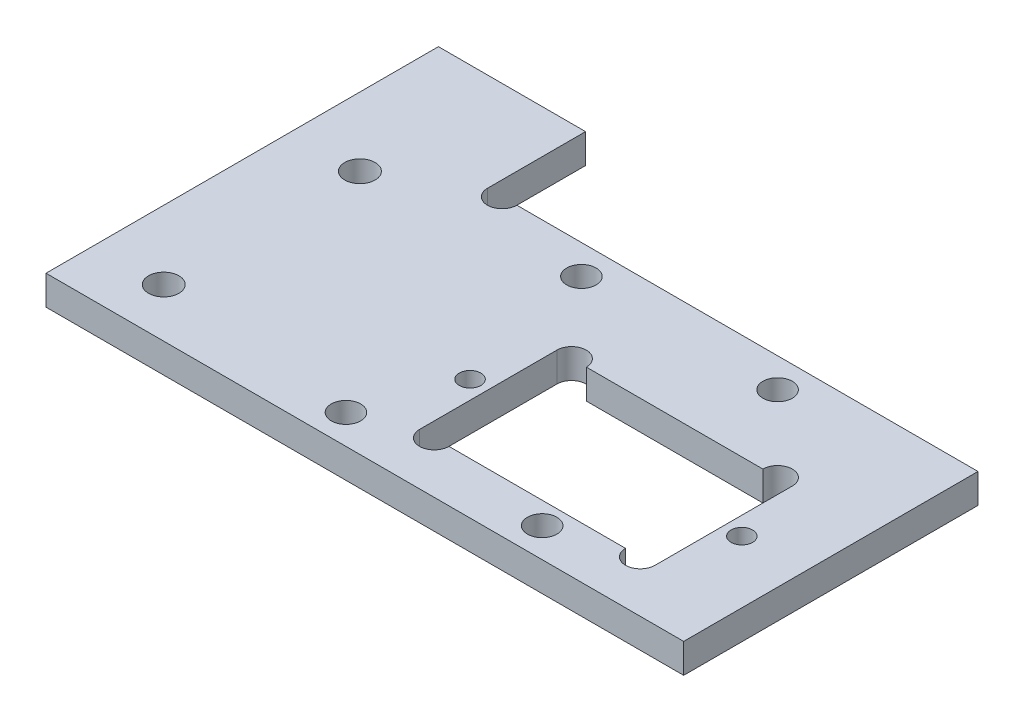
ISO-10303-21;
HEADER;
FILE_DESCRIPTION(('STEP AP214'),'2;1');
FILE_NAME('part.step','',(''),(''),'','','');
FILE_SCHEMA(('AUTOMOTIVE_DESIGN { 1 0 10303 214 1 1 1 1 }'));
ENDSEC;
DATA;
#1=APPLICATION_CONTEXT('core data for automotive mechanical design processes');
#2=APPLICATION_PROTOCOL_DEFINITION('international standard','automotive_design',2000,#1);
#3=PRODUCT_CONTEXT('',#1,'mechanical');
#4=PRODUCT('Part','Part','',(#3));
#5=PRODUCT_RELATED_PRODUCT_CATEGORY('part','',(#4));
#6=PRODUCT_DEFINITION_FORMATION('','',#4);
#7=PRODUCT_DEFINITION_CONTEXT('part definition',#1,'design');
#8=PRODUCT_DEFINITION('design','',#6,#7);
#9=PRODUCT_DEFINITION_SHAPE('','',#8);
#10=(LENGTH_UNIT() NAMED_UNIT(*) SI_UNIT(.MILLI.,.METRE.));
#11=(NAMED_UNIT(*) PLANE_ANGLE_UNIT() SI_UNIT($,.RADIAN.));
#12=(NAMED_UNIT(*) SI_UNIT($,.STERADIAN.) SOLID_ANGLE_UNIT());
#13=UNCERTAINTY_MEASURE_WITH_UNIT(LENGTH_MEASURE(1.E-05),#10,'distance_accuracy_value','');
#14=(GEOMETRIC_REPRESENTATION_CONTEXT(3) GLOBAL_UNCERTAINTY_ASSIGNED_CONTEXT((#13)) GLOBAL_UNIT_ASSIGNED_CONTEXT((#10,
#11,#12)) REPRESENTATION_CONTEXT('',''));
#15=CARTESIAN_POINT('',(0.,0.,0.));
#16=DIRECTION('',(0.,0.,1.));
#17=DIRECTION('',(1.,0.,0.));
#18=AXIS2_PLACEMENT_3D('',#15,#16,#17);
#19=CARTESIAN_POINT('',(32.5,3.,-20.));
#20=DIRECTION('',(-1.,0.,0.));
#21=DIRECTION('',(0.,0.,1.));
#22=AXIS2_PLACEMENT_3D('',#19,#20,#21);
#23=PLANE('',#22);
#24=DIRECTION('',(0.,0.,-1.));
#25=VECTOR('',#24,1.);
#26=CARTESIAN_POINT('',(32.5,0.,-20.));
#27=LINE('',#26,#25);
#28=CARTESIAN_POINT('',(32.5,0.,20.));
#29=VERTEX_POINT('',#28);
#30=CARTESIAN_POINT('',(32.5,0.,-9.99999999999998));
#31=VERTEX_POINT('',#30);
#32=EDGE_CURVE('E206',#29,#31,#27,.T.);
#33=ORIENTED_EDGE('',*,*,#32,.T.);
#34=DIRECTION('',(0.,-1.,0.));
#35=VECTOR('',#34,1.);
#36=CARTESIAN_POINT('',(32.5,10.,-9.99999999999998));
#37=LINE('',#36,#35);
#38=CARTESIAN_POINT('',(32.5,3.,-9.99999999999998));
#39=VERTEX_POINT('',#38);
#40=EDGE_CURVE('E166',#39,#31,#37,.T.);
#41=ORIENTED_EDGE('',*,*,#40,.F.);
#42=DIRECTION('',(0.,0.,-1.));
#43=VECTOR('',#42,1.);
#44=CARTESIAN_POINT('',(32.5,3.,-20.));
#45=LINE('',#44,#43);
#46=CARTESIAN_POINT('',(32.5,3.,20.));
#47=VERTEX_POINT('',#46);
#48=EDGE_CURVE('E207',#47,#39,#45,.T.);
#49=ORIENTED_EDGE('',*,*,#48,.F.);
#50=DIRECTION('',(0.,-1.,0.));
#51=VECTOR('',#50,1.);
#52=CARTESIAN_POINT('',(32.5,3.,20.));
#53=LINE('',#52,#51);
#54=EDGE_CURVE('E220',#47,#29,#53,.T.);
#55=ORIENTED_EDGE('',*,*,#54,.T.);
#56=EDGE_LOOP('',(#33,#41,#49,#55));
#57=FACE_BOUND('',#56,.T.);
#58=ADVANCED_FACE('F45',(#57),#23,.F.);
#59=CARTESIAN_POINT('',(-32.5,3.,-20.));
#60=DIRECTION('',(0.,0.,1.));
#61=DIRECTION('',(1.,0.,0.));
#62=AXIS2_PLACEMENT_3D('',#59,#60,#61);
#63=PLANE('',#62);
#64=DIRECTION('',(-1.,0.,0.));
#65=VECTOR('',#64,1.);
#66=CARTESIAN_POINT('',(-32.5,3.,-20.));
#67=LINE('',#66,#65);
#68=CARTESIAN_POINT('',(-17.5,3.,-20.));
#69=VERTEX_POINT('',#68);
#70=CARTESIAN_POINT('',(-32.5,3.,-20.));
#71=VERTEX_POINT('',#70);
#72=EDGE_CURVE('E211',#69,#71,#67,.T.);
#73=ORIENTED_EDGE('',*,*,#72,.F.);
#74=DIRECTION('',(0.,-1.,0.));
#75=VECTOR('',#74,1.);
#76=CARTESIAN_POINT('',(-17.5,10.,-20.));
#77=LINE('',#76,#75);
#78=CARTESIAN_POINT('',(-17.5,0.,-20.));
#79=VERTEX_POINT('',#78);
#80=EDGE_CURVE('E165',#69,#79,#77,.T.);
#81=ORIENTED_EDGE('',*,*,#80,.T.);
#82=DIRECTION('',(-1.,0.,0.));
#83=VECTOR('',#82,1.);
#84=CARTESIAN_POINT('',(-32.5,0.,-20.));
#85=LINE('',#84,#83);
#86=CARTESIAN_POINT('',(-32.5,0.,-20.));
#87=VERTEX_POINT('',#86);
#88=EDGE_CURVE('E171',#79,#87,#85,.T.);
#89=ORIENTED_EDGE('',*,*,#88,.T.);
#90=DIRECTION('',(0.,-1.,0.));
#91=VECTOR('',#90,1.);
#92=CARTESIAN_POINT('',(-32.5,3.,-20.));
#93=LINE('',#92,#91);
#94=EDGE_CURVE('E238',#71,#87,#93,.T.);
#95=ORIENTED_EDGE('',*,*,#94,.F.);
#96=EDGE_LOOP('',(#73,#81,#89,#95));
#97=FACE_BOUND('',#96,.T.);
#98=ADVANCED_FACE('F402',(#97),#63,.F.);
#99=CARTESIAN_POINT('',(-32.5,3.,-20.));
#100=DIRECTION('',(1.,0.,0.));
#101=DIRECTION('',(0.,0.,-1.));
#102=AXIS2_PLACEMENT_3D('',#99,#100,#101);
#103=PLANE('',#102);
#104=DIRECTION('',(0.,0.,1.));
#105=VECTOR('',#104,1.);
#106=CARTESIAN_POINT('',(-32.5,0.,-20.));
#107=LINE('',#106,#105);
#108=CARTESIAN_POINT('',(-32.5,0.,20.));
#109=VERTEX_POINT('',#108);
#110=EDGE_CURVE('E226',#87,#109,#107,.T.);
#111=ORIENTED_EDGE('',*,*,#110,.T.);
#112=DIRECTION('',(0.,-1.,0.));
#113=VECTOR('',#112,1.);
#114=CARTESIAN_POINT('',(-32.5,3.,20.));
#115=LINE('',#114,#113);
#116=CARTESIAN_POINT('',(-32.5,3.,20.));
#117=VERTEX_POINT('',#116);
#118=EDGE_CURVE('E234',#117,#109,#115,.T.);
#119=ORIENTED_EDGE('',*,*,#118,.F.);
#120=DIRECTION('',(0.,0.,1.));
#121=VECTOR('',#120,1.);
#122=CARTESIAN_POINT('',(-32.5,3.,-20.));
#123=LINE('',#122,#121);
#124=EDGE_CURVE('E215',#71,#117,#123,.T.);
#125=ORIENTED_EDGE('',*,*,#124,.F.);
#126=ORIENTED_EDGE('',*,*,#94,.T.);
#127=EDGE_LOOP('',(#111,#119,#125,#126));
#128=FACE_BOUND('',#127,.T.);
#129=ADVANCED_FACE('F406',(#128),#103,.F.);
#130=CARTESIAN_POINT('',(-32.5,3.,20.));
#131=DIRECTION('',(0.,0.,-1.));
#132=DIRECTION('',(-1.,0.,0.));
#133=AXIS2_PLACEMENT_3D('',#130,#131,#132);
#134=PLANE('',#133);
#135=DIRECTION('',(1.,0.,0.));
#136=VECTOR('',#135,1.);
#137=CARTESIAN_POINT('',(-32.5,0.,20.));
#138=LINE('',#137,#136);
#139=EDGE_CURVE('E212',#109,#29,#138,.T.);
#140=ORIENTED_EDGE('',*,*,#139,.T.);
#141=ORIENTED_EDGE('',*,*,#54,.F.);
#142=DIRECTION('',(1.,0.,0.));
#143=VECTOR('',#142,1.);
#144=CARTESIAN_POINT('',(-32.5,3.,20.));
#145=LINE('',#144,#143);
#146=EDGE_CURVE('E217',#117,#47,#145,.T.);
#147=ORIENTED_EDGE('',*,*,#146,.F.);
#148=ORIENTED_EDGE('',*,*,#118,.T.);
#149=EDGE_LOOP('',(#140,#141,#147,#148));
#150=FACE_BOUND('',#149,.T.);
#151=ADVANCED_FACE('F378',(#150),#134,.F.);
#152=CARTESIAN_POINT('',(0.,3.,0.));
#153=DIRECTION('',(0.,1.,0.));
#154=DIRECTION('',(0.,0.,1.));
#155=AXIS2_PLACEMENT_3D('',#152,#153,#154);
#156=PLANE('',#155);
#157=CARTESIAN_POINT('',(-16.,3.,-9.99999999999998));
#158=DIRECTION('',(0.,1.,0.));
#159=DIRECTION('',(0.,0.,1.));
#160=AXIS2_PLACEMENT_3D('',#157,#158,#159);
#161=CIRCLE('',#160,1.50000000000001);
#162=CARTESIAN_POINT('',(-17.5,3.,-9.99999999999998));
#163=VERTEX_POINT('',#162);
#164=CARTESIAN_POINT('',(-14.5,3.,-9.99999999999998));
#165=VERTEX_POINT('',#164);
#166=EDGE_CURVE('E416',#163,#165,#161,.T.);
#167=ORIENTED_EDGE('',*,*,#166,.F.);
#168=DIRECTION('',(0.,0.,1.));
#169=VECTOR('',#168,1.);
#170=CARTESIAN_POINT('',(-17.5,3.,0.));
#171=LINE('',#170,#169);
#172=EDGE_CURVE('E163',#69,#163,#171,.T.);
#173=ORIENTED_EDGE('',*,*,#172,.F.);
#174=ORIENTED_EDGE('',*,*,#72,.T.);
#175=ORIENTED_EDGE('',*,*,#124,.T.);
#176=ORIENTED_EDGE('',*,*,#146,.T.);
#177=ORIENTED_EDGE('',*,*,#48,.T.);
#178=DIRECTION('',(1.,0.,0.));
#179=VECTOR('',#178,1.);
#180=CARTESIAN_POINT('',(0.,3.,-9.99999999999998));
#181=LINE('',#180,#179);
#182=EDGE_CURVE('E185',#165,#39,#181,.T.);
#183=ORIENTED_EDGE('',*,*,#182,.F.);
#184=EDGE_LOOP('',(#167,#173,#174,#175,#176,#177,#183));
#185=FACE_BOUND('',#184,.T.);
#186=CARTESIAN_POINT('',(1.82494999997478,3.,0.750000000000394));
#187=DIRECTION('',(0.,1.,0.));
#188=DIRECTION('',(0.,0.,1.));
#189=AXIS2_PLACEMENT_3D('',#186,#187,#188);
#190=CIRCLE('',#189,1.50000000000001);
#191=CARTESIAN_POINT('',(3.32494999997479,3.,0.750000000000394));
#192=VERTEX_POINT('',#191);
#193=CARTESIAN_POINT('',(0.324949999974764,3.,0.750000000000394));
#194=VERTEX_POINT('',#193);
#195=EDGE_CURVE('E319',#192,#194,#190,.T.);
#196=ORIENTED_EDGE('',*,*,#195,.F.);
#197=DIRECTION('',(-1.,0.,0.));
#198=VECTOR('',#197,1.);
#199=CARTESIAN_POINT('',(0.,3.,0.750000000000394));
#200=LINE('',#199,#198);
#201=CARTESIAN_POINT('',(21.3249499999748,3.,0.750000000000394));
#202=VERTEX_POINT('',#201);
#203=EDGE_CURVE('E292',#202,#192,#200,.T.);
#204=ORIENTED_EDGE('',*,*,#203,.F.);
#205=CARTESIAN_POINT('',(22.8249499999748,3.,0.750000000000394));
#206=DIRECTION('',(0.,1.,0.));
#207=DIRECTION('',(0.,0.,1.));
#208=AXIS2_PLACEMENT_3D('',#205,#206,#207);
#209=CIRCLE('',#208,1.50000000000002);
#210=CARTESIAN_POINT('',(24.3249499999748,3.,0.750000000000394));
#211=VERTEX_POINT('',#210);
#212=EDGE_CURVE('E599',#211,#202,#209,.T.);
#213=ORIENTED_EDGE('',*,*,#212,.F.);
#214=DIRECTION('',(0.,0.,-1.));
#215=VECTOR('',#214,1.);
#216=CARTESIAN_POINT('',(24.3249499999748,3.,0.));
#217=LINE('',#216,#215);
#218=CARTESIAN_POINT('',(24.3249499999748,3.,14.7500000000004));
#219=VERTEX_POINT('',#218);
#220=EDGE_CURVE('E305',#219,#211,#217,.T.);
#221=ORIENTED_EDGE('',*,*,#220,.F.);
#222=CARTESIAN_POINT('',(22.8249499999748,3.,14.7500000000004));
#223=DIRECTION('',(0.,1.,0.));
#224=DIRECTION('',(0.,0.,1.));
#225=AXIS2_PLACEMENT_3D('',#222,#223,#224);
#226=CIRCLE('',#225,1.50000000000002);
#227=CARTESIAN_POINT('',(21.3249499999748,3.,14.7500000000004));
#228=VERTEX_POINT('',#227);
#229=EDGE_CURVE('E332',#228,#219,#226,.T.);
#230=ORIENTED_EDGE('',*,*,#229,.F.);
#231=DIRECTION('',(1.,0.,0.));
#232=VECTOR('',#231,1.);
#233=CARTESIAN_POINT('',(0.,3.,14.7500000000004));
#234=LINE('',#233,#232);
#235=CARTESIAN_POINT('',(3.32494999997479,3.,14.7500000000004));
#236=VERTEX_POINT('',#235);
#237=EDGE_CURVE('E309',#236,#228,#234,.T.);
#238=ORIENTED_EDGE('',*,*,#237,.F.);
#239=CARTESIAN_POINT('',(1.82494999997478,3.,14.7500000000004));
#240=DIRECTION('',(0.,1.,0.));
#241=DIRECTION('',(0.,0.,1.));
#242=AXIS2_PLACEMENT_3D('',#239,#240,#241);
#243=CIRCLE('',#242,1.50000000000001);
#244=CARTESIAN_POINT('',(0.324949999974764,3.,14.7500000000004));
#245=VERTEX_POINT('',#244);
#246=EDGE_CURVE('E321',#245,#236,#243,.T.);
#247=ORIENTED_EDGE('',*,*,#246,.F.);
#248=DIRECTION('',(0.,0.,1.));
#249=VECTOR('',#248,1.);
#250=CARTESIAN_POINT('',(0.324949999974778,3.,0.));
#251=LINE('',#250,#249);
#252=EDGE_CURVE('E180',#194,#245,#251,.T.);
#253=ORIENTED_EDGE('',*,*,#252,.F.);
#254=EDGE_LOOP('',(#196,#204,#213,#221,#230,#238,#247,#253));
#255=FACE_BOUND('',#254,.T.);
#256=CARTESIAN_POINT('',(-4.92502499999987,3.,16.9999999999999));
#257=DIRECTION('',(0.,1.,0.));
#258=DIRECTION('',(0.,0.,1.));
#259=AXIS2_PLACEMENT_3D('',#256,#257,#258);
#260=CIRCLE('',#259,1.5);
#261=CARTESIAN_POINT('',(-4.92502499999987,3.,18.4999999999999));
#262=VERTEX_POINT('',#261);
#263=EDGE_CURVE('E362',#262,#262,#260,.T.);
#264=ORIENTED_EDGE('',*,*,#263,.F.);
#265=EDGE_LOOP('',(#264));
#266=FACE_BOUND('',#265,.T.);
#267=CARTESIAN_POINT('',(15.0749750000001,3.,-7.00000000000009));
#268=DIRECTION('',(0.,1.,0.));
#269=DIRECTION('',(0.,0.,1.));
#270=AXIS2_PLACEMENT_3D('',#267,#268,#269);
#271=CIRCLE('',#270,1.5);
#272=CARTESIAN_POINT('',(15.0749750000001,3.,-5.50000000000009));
#273=VERTEX_POINT('',#272);
#274=EDGE_CURVE('E358',#273,#273,#271,.T.);
#275=ORIENTED_EDGE('',*,*,#274,.F.);
#276=EDGE_LOOP('',(#275));
#277=FACE_BOUND('',#276,.T.);
#278=CARTESIAN_POINT('',(-4.9250249999999,3.,-7.00000000000008));
#279=DIRECTION('',(0.,1.,0.));
#280=DIRECTION('',(0.,0.,1.));
#281=AXIS2_PLACEMENT_3D('',#278,#279,#280);
#282=CIRCLE('',#281,1.5);
#283=CARTESIAN_POINT('',(-4.9250249999999,3.,-5.50000000000008));
#284=VERTEX_POINT('',#283);
#285=EDGE_CURVE('E354',#284,#284,#282,.T.);
#286=ORIENTED_EDGE('',*,*,#285,.F.);
#287=EDGE_LOOP('',(#286));
#288=FACE_BOUND('',#287,.T.);
#289=CARTESIAN_POINT('',(15.0749750000001,3.,16.9999999999999));
#290=DIRECTION('',(0.,1.,0.));
#291=DIRECTION('',(0.,0.,1.));
#292=AXIS2_PLACEMENT_3D('',#289,#290,#291);
#293=CIRCLE('',#292,1.5);
#294=CARTESIAN_POINT('',(15.0749750000001,3.,18.4999999999999));
#295=VERTEX_POINT('',#294);
#296=EDGE_CURVE('E351',#295,#295,#293,.T.);
#297=ORIENTED_EDGE('',*,*,#296,.F.);
#298=EDGE_LOOP('',(#297));
#299=FACE_BOUND('',#298,.T.);
#300=CARTESIAN_POINT('',(26.1749499999748,3.,7.7500000000004));
#301=DIRECTION('',(0.,1.,0.));
#302=DIRECTION('',(0.,0.,1.));
#303=AXIS2_PLACEMENT_3D('',#300,#301,#302);
#304=CIRCLE('',#303,1.10000000000004);
#305=CARTESIAN_POINT('',(26.1749499999748,3.,8.85000000000043));
#306=VERTEX_POINT('',#305);
#307=EDGE_CURVE('E248',#306,#306,#304,.T.);
#308=ORIENTED_EDGE('',*,*,#307,.F.);
#309=EDGE_LOOP('',(#308));
#310=FACE_BOUND('',#309,.T.);
#311=CARTESIAN_POINT('',(-1.52505000002522,3.,7.75000000000042));
#312=DIRECTION('',(0.,1.,0.));
#313=DIRECTION('',(0.,0.,1.));
#314=AXIS2_PLACEMENT_3D('',#311,#312,#313);
#315=CIRCLE('',#314,1.1);
#316=CARTESIAN_POINT('',(-1.52505000002522,3.,8.85000000000042));
#317=VERTEX_POINT('',#316);
#318=EDGE_CURVE('E281',#317,#317,#315,.T.);
#319=ORIENTED_EDGE('',*,*,#318,.F.);
#320=EDGE_LOOP('',(#319));
#321=FACE_BOUND('',#320,.T.);
#322=CARTESIAN_POINT('',(-25.5,3.,15.));
#323=DIRECTION('',(0.,1.,0.));
#324=DIRECTION('',(0.,0.,1.));
#325=AXIS2_PLACEMENT_3D('',#322,#323,#324);
#326=CIRCLE('',#325,1.55);
#327=CARTESIAN_POINT('',(-25.5,3.,16.55));
#328=VERTEX_POINT('',#327);
#329=EDGE_CURVE('E202',#328,#328,#326,.T.);
#330=ORIENTED_EDGE('',*,*,#329,.F.);
#331=EDGE_LOOP('',(#330));
#332=FACE_BOUND('',#331,.T.);
#333=CARTESIAN_POINT('',(-25.5,3.,-5.00000000000002));
#334=DIRECTION('',(0.,1.,0.));
#335=DIRECTION('',(0.,0.,1.));
#336=AXIS2_PLACEMENT_3D('',#333,#334,#335);
#337=CIRCLE('',#336,1.55);
#338=CARTESIAN_POINT('',(-25.5,3.,-3.45000000000002));
#339=VERTEX_POINT('',#338);
#340=EDGE_CURVE('E196',#339,#339,#337,.T.);
#341=ORIENTED_EDGE('',*,*,#340,.F.);
#342=EDGE_LOOP('',(#341));
#343=FACE_BOUND('',#342,.T.);
#344=ADVANCED_FACE('F316',(#185,#255,#266,#277,#288,#299,#310,#321,#332,#343),#156,.T.);
#345=CARTESIAN_POINT('',(0.,0.,0.));
#346=DIRECTION('',(0.,1.,0.));
#347=DIRECTION('',(0.,0.,1.));
#348=AXIS2_PLACEMENT_3D('',#345,#346,#347);
#349=PLANE('',#348);
#350=CARTESIAN_POINT('',(-4.92502499999987,0.,16.9999999999999));
#351=DIRECTION('',(0.,-1.,0.));
#352=DIRECTION('',(0.,0.,-1.));
#353=AXIS2_PLACEMENT_3D('',#350,#351,#352);
#354=CIRCLE('',#353,1.5);
#355=CARTESIAN_POINT('',(-4.92502499999987,0.,15.4999999999999));
#356=VERTEX_POINT('',#355);
#357=EDGE_CURVE('E340',#356,#356,#354,.T.);
#358=ORIENTED_EDGE('',*,*,#357,.F.);
#359=EDGE_LOOP('',(#358));
#360=FACE_BOUND('',#359,.T.);
#361=CARTESIAN_POINT('',(15.0749750000001,0.,-7.00000000000009));
#362=DIRECTION('',(0.,-1.,0.));
#363=DIRECTION('',(0.,0.,-1.));
#364=AXIS2_PLACEMENT_3D('',#361,#362,#363);
#365=CIRCLE('',#364,1.5);
#366=CARTESIAN_POINT('',(15.0749750000001,0.,-8.5000000000001));
#367=VERTEX_POINT('',#366);
#368=EDGE_CURVE('E339',#367,#367,#365,.T.);
#369=ORIENTED_EDGE('',*,*,#368,.F.);
#370=EDGE_LOOP('',(#369));
#371=FACE_BOUND('',#370,.T.);
#372=CARTESIAN_POINT('',(-4.9250249999999,0.,-7.00000000000008));
#373=DIRECTION('',(0.,-1.,0.));
#374=DIRECTION('',(0.,0.,-1.));
#375=AXIS2_PLACEMENT_3D('',#372,#373,#374);
#376=CIRCLE('',#375,1.5);
#377=CARTESIAN_POINT('',(-4.9250249999999,0.,-8.50000000000008));
#378=VERTEX_POINT('',#377);
#379=EDGE_CURVE('E329',#378,#378,#376,.T.);
#380=ORIENTED_EDGE('',*,*,#379,.F.);
#381=EDGE_LOOP('',(#380));
#382=FACE_BOUND('',#381,.T.);
#383=CARTESIAN_POINT('',(15.0749750000001,0.,16.9999999999999));
#384=DIRECTION('',(0.,-1.,0.));
#385=DIRECTION('',(0.,0.,-1.));
#386=AXIS2_PLACEMENT_3D('',#383,#384,#385);
#387=CIRCLE('',#386,1.5);
#388=CARTESIAN_POINT('',(15.0749750000001,0.,15.4999999999999));
#389=VERTEX_POINT('',#388);
#390=EDGE_CURVE('E344',#389,#389,#387,.T.);
#391=ORIENTED_EDGE('',*,*,#390,.F.);
#392=EDGE_LOOP('',(#391));
#393=FACE_BOUND('',#392,.T.);
#394=CARTESIAN_POINT('',(26.1749499999748,0.,7.7500000000004));
#395=DIRECTION('',(0.,1.,0.));
#396=DIRECTION('',(0.,0.,1.));
#397=AXIS2_PLACEMENT_3D('',#394,#395,#396);
#398=CIRCLE('',#397,1.10000000000004);
#399=CARTESIAN_POINT('',(26.1749499999748,0.,8.85000000000043));
#400=VERTEX_POINT('',#399);
#401=EDGE_CURVE('E247',#400,#400,#398,.T.);
#402=ORIENTED_EDGE('',*,*,#401,.T.);
#403=EDGE_LOOP('',(#402));
#404=FACE_BOUND('',#403,.T.);
#405=CARTESIAN_POINT('',(-1.52505000002522,0.,7.75000000000042));
#406=DIRECTION('',(0.,1.,0.));
#407=DIRECTION('',(0.,0.,1.));
#408=AXIS2_PLACEMENT_3D('',#405,#406,#407);
#409=CIRCLE('',#408,1.1);
#410=CARTESIAN_POINT('',(-1.52505000002522,0.,8.85000000000042));
#411=VERTEX_POINT('',#410);
#412=EDGE_CURVE('E243',#411,#411,#409,.T.);
#413=ORIENTED_EDGE('',*,*,#412,.T.);
#414=EDGE_LOOP('',(#413));
#415=FACE_BOUND('',#414,.T.);
#416=DIRECTION('',(1.,0.,0.));
#417=VECTOR('',#416,1.);
#418=CARTESIAN_POINT('',(24.3249499999748,0.,0.750000000000394));
#419=LINE('',#418,#417);
#420=CARTESIAN_POINT('',(3.32494999997479,0.,0.750000000000394));
#421=VERTEX_POINT('',#420);
#422=CARTESIAN_POINT('',(21.3249499999748,0.,0.750000000000394));
#423=VERTEX_POINT('',#422);
#424=EDGE_CURVE('E66',#421,#423,#419,.T.);
#425=ORIENTED_EDGE('',*,*,#424,.F.);
#426=CARTESIAN_POINT('',(1.82494999997478,0.,0.750000000000394));
#427=DIRECTION('',(0.,1.,0.));
#428=DIRECTION('',(0.,0.,1.));
#429=AXIS2_PLACEMENT_3D('',#426,#427,#428);
#430=CIRCLE('',#429,1.50000000000001);
#431=CARTESIAN_POINT('',(0.324949999974778,0.,0.750000000000394));
#432=VERTEX_POINT('',#431);
#433=EDGE_CURVE('E52',#421,#432,#430,.T.);
#434=ORIENTED_EDGE('',*,*,#433,.T.);
#435=DIRECTION('',(0.,0.,-1.));
#436=VECTOR('',#435,1.);
#437=CARTESIAN_POINT('',(0.324949999974778,0.,0.750000000000394));
#438=LINE('',#437,#436);
#439=CARTESIAN_POINT('',(0.324949999974765,0.,14.7500000000004));
#440=VERTEX_POINT('',#439);
#441=EDGE_CURVE('E252',#440,#432,#438,.T.);
#442=ORIENTED_EDGE('',*,*,#441,.F.);
#443=CARTESIAN_POINT('',(1.82494999997478,0.,14.7500000000004));
#444=DIRECTION('',(0.,1.,0.));
#445=DIRECTION('',(0.,0.,1.));
#446=AXIS2_PLACEMENT_3D('',#443,#444,#445);
#447=CIRCLE('',#446,1.50000000000001);
#448=CARTESIAN_POINT('',(3.32494999997479,0.,14.7500000000004));
#449=VERTEX_POINT('',#448);
#450=EDGE_CURVE('E242',#440,#449,#447,.T.);
#451=ORIENTED_EDGE('',*,*,#450,.T.);
#452=DIRECTION('',(-1.,0.,0.));
#453=VECTOR('',#452,1.);
#454=CARTESIAN_POINT('',(24.3249499999748,0.,14.7500000000004));
#455=LINE('',#454,#453);
#456=CARTESIAN_POINT('',(21.3249499999748,0.,14.7500000000004));
#457=VERTEX_POINT('',#456);
#458=EDGE_CURVE('E287',#457,#449,#455,.T.);
#459=ORIENTED_EDGE('',*,*,#458,.F.);
#460=CARTESIAN_POINT('',(22.8249499999748,0.,14.7500000000004));
#461=DIRECTION('',(0.,1.,0.));
#462=DIRECTION('',(0.,0.,1.));
#463=AXIS2_PLACEMENT_3D('',#460,#461,#462);
#464=CIRCLE('',#463,1.50000000000001);
#465=CARTESIAN_POINT('',(24.3249499999748,0.,14.7500000000004));
#466=VERTEX_POINT('',#465);
#467=EDGE_CURVE('E255',#457,#466,#464,.T.);
#468=ORIENTED_EDGE('',*,*,#467,.T.);
#469=DIRECTION('',(0.,0.,1.));
#470=VECTOR('',#469,1.);
#471=CARTESIAN_POINT('',(24.3249499999748,0.,0.750000000000394));
#472=LINE('',#471,#470);
#473=CARTESIAN_POINT('',(24.3249499999748,0.,0.750000000000394));
#474=VERTEX_POINT('',#473);
#475=EDGE_CURVE('E278',#474,#466,#472,.T.);
#476=ORIENTED_EDGE('',*,*,#475,.F.);
#477=CARTESIAN_POINT('',(22.8249499999748,0.,0.750000000000394));
#478=DIRECTION('',(0.,1.,0.));
#479=DIRECTION('',(0.,0.,1.));
#480=AXIS2_PLACEMENT_3D('',#477,#478,#479);
#481=CIRCLE('',#480,1.50000000000001);
#482=EDGE_CURVE('E258',#474,#423,#481,.T.);
#483=ORIENTED_EDGE('',*,*,#482,.T.);
#484=EDGE_LOOP('',(#425,#434,#442,#451,#459,#468,#476,#483));
#485=FACE_BOUND('',#484,.T.);
#486=CARTESIAN_POINT('',(-25.5,0.,15.));
#487=DIRECTION('',(0.,-1.,0.));
#488=DIRECTION('',(0.,0.,-1.));
#489=AXIS2_PLACEMENT_3D('',#486,#487,#488);
#490=CIRCLE('',#489,1.55);
#491=CARTESIAN_POINT('',(-25.5,0.,13.45));
#492=VERTEX_POINT('',#491);
#493=EDGE_CURVE('E192',#492,#492,#490,.T.);
#494=ORIENTED_EDGE('',*,*,#493,.F.);
#495=EDGE_LOOP('',(#494));
#496=FACE_BOUND('',#495,.T.);
#497=CARTESIAN_POINT('',(-25.5,0.,-5.00000000000002));
#498=DIRECTION('',(0.,-1.,0.));
#499=DIRECTION('',(0.,0.,-1.));
#500=AXIS2_PLACEMENT_3D('',#497,#498,#499);
#501=CIRCLE('',#500,1.55);
#502=CARTESIAN_POINT('',(-25.5,0.,-6.55000000000002));
#503=VERTEX_POINT('',#502);
#504=EDGE_CURVE('E191',#503,#503,#501,.T.);
#505=ORIENTED_EDGE('',*,*,#504,.F.);
#506=EDGE_LOOP('',(#505));
#507=FACE_BOUND('',#506,.T.);
#508=DIRECTION('',(0.,0.,-1.));
#509=VECTOR('',#508,1.);
#510=CARTESIAN_POINT('',(-17.5,0.,-20.));
#511=LINE('',#510,#509);
#512=CARTESIAN_POINT('',(-17.5,0.,-9.99999999999998));
#513=VERTEX_POINT('',#512);
#514=EDGE_CURVE('E160',#513,#79,#511,.T.);
#515=ORIENTED_EDGE('',*,*,#514,.F.);
#516=CARTESIAN_POINT('',(-16.,0.,-9.99999999999998));
#517=DIRECTION('',(0.,1.,0.));
#518=DIRECTION('',(0.,0.,1.));
#519=AXIS2_PLACEMENT_3D('',#516,#517,#518);
#520=CIRCLE('',#519,1.50000000000001);
#521=CARTESIAN_POINT('',(-14.5,0.,-9.99999999999998));
#522=VERTEX_POINT('',#521);
#523=EDGE_CURVE('E11',#513,#522,#520,.T.);
#524=ORIENTED_EDGE('',*,*,#523,.T.);
#525=DIRECTION('',(-1.,0.,0.));
#526=VECTOR('',#525,1.);
#527=CARTESIAN_POINT('',(32.5,0.,-9.99999999999998));
#528=LINE('',#527,#526);
#529=EDGE_CURVE('E173',#31,#522,#528,.T.);
#530=ORIENTED_EDGE('',*,*,#529,.F.);
#531=ORIENTED_EDGE('',*,*,#32,.F.);
#532=ORIENTED_EDGE('',*,*,#139,.F.);
#533=ORIENTED_EDGE('',*,*,#110,.F.);
#534=ORIENTED_EDGE('',*,*,#88,.F.);
#535=EDGE_LOOP('',(#515,#524,#530,#531,#532,#533,#534));
#536=FACE_BOUND('',#535,.T.);
#537=ADVANCED_FACE('F169',(#360,#371,#382,#393,#404,#415,#485,#496,#507,#536),#349,.F.);
#538=CARTESIAN_POINT('',(-25.5,10.,-5.00000000000002));
#539=DIRECTION('',(0.,-1.,0.));
#540=DIRECTION('',(0.,0.,-1.));
#541=AXIS2_PLACEMENT_3D('',#538,#539,#540);
#542=CYLINDRICAL_SURFACE('',#541,1.55);
#543=ORIENTED_EDGE('',*,*,#340,.T.);
#544=EDGE_LOOP('',(#543));
#545=FACE_BOUND('',#544,.T.);
#546=ORIENTED_EDGE('',*,*,#504,.T.);
#547=EDGE_LOOP('',(#546));
#548=FACE_BOUND('',#547,.T.);
#549=ADVANCED_FACE('F385',(#545,#548),#542,.F.);
#550=CARTESIAN_POINT('',(-25.5,10.,15.));
#551=DIRECTION('',(0.,-1.,0.));
#552=DIRECTION('',(0.,0.,-1.));
#553=AXIS2_PLACEMENT_3D('',#550,#551,#552);
#554=CYLINDRICAL_SURFACE('',#553,1.55);
#555=ORIENTED_EDGE('',*,*,#329,.T.);
#556=EDGE_LOOP('',(#555));
#557=FACE_BOUND('',#556,.T.);
#558=ORIENTED_EDGE('',*,*,#493,.T.);
#559=EDGE_LOOP('',(#558));
#560=FACE_BOUND('',#559,.T.);
#561=ADVANCED_FACE('F388',(#557,#560),#554,.F.);
#562=CARTESIAN_POINT('',(-17.5,10.,-20.));
#563=DIRECTION('',(-1.,0.,0.));
#564=DIRECTION('',(0.,0.,1.));
#565=AXIS2_PLACEMENT_3D('',#562,#563,#564);
#566=PLANE('',#565);
#567=ORIENTED_EDGE('',*,*,#172,.T.);
#568=DIRECTION('',(0.,-1.,0.));
#569=VECTOR('',#568,1.);
#570=CARTESIAN_POINT('',(-17.5,10.,-9.99999999999998));
#571=LINE('',#570,#569);
#572=EDGE_CURVE('E151',#163,#513,#571,.T.);
#573=ORIENTED_EDGE('',*,*,#572,.T.);
#574=ORIENTED_EDGE('',*,*,#514,.T.);
#575=ORIENTED_EDGE('',*,*,#80,.F.);
#576=EDGE_LOOP('',(#567,#573,#574,#575));
#577=FACE_BOUND('',#576,.T.);
#578=ADVANCED_FACE('F159',(#577),#566,.F.);
#579=CARTESIAN_POINT('',(32.5,10.,-9.99999999999998));
#580=DIRECTION('',(0.,0.,1.));
#581=DIRECTION('',(1.,0.,0.));
#582=AXIS2_PLACEMENT_3D('',#579,#580,#581);
#583=PLANE('',#582);
#584=ORIENTED_EDGE('',*,*,#529,.T.);
#585=DIRECTION('',(0.,1.,0.));
#586=VECTOR('',#585,1.);
#587=CARTESIAN_POINT('',(-14.5,3.,-9.99999999999998));
#588=LINE('',#587,#586);
#589=EDGE_CURVE('E59',#522,#165,#588,.T.);
#590=ORIENTED_EDGE('',*,*,#589,.T.);
#591=ORIENTED_EDGE('',*,*,#182,.T.);
#592=ORIENTED_EDGE('',*,*,#40,.T.);
#593=EDGE_LOOP('',(#584,#590,#591,#592));
#594=FACE_BOUND('',#593,.T.);
#595=ADVANCED_FACE('F414',(#594),#583,.F.);
#596=CARTESIAN_POINT('',(0.324949999974778,10.,0.750000000000394));
#597=DIRECTION('',(-1.,0.,0.));
#598=DIRECTION('',(0.,0.,1.));
#599=AXIS2_PLACEMENT_3D('',#596,#597,#598);
#600=PLANE('',#599);
#601=ORIENTED_EDGE('',*,*,#252,.T.);
#602=DIRECTION('',(0.,-1.,0.));
#603=VECTOR('',#602,1.);
#604=CARTESIAN_POINT('',(0.324949999974778,10.,14.7500000000004));
#605=LINE('',#604,#603);
#606=EDGE_CURVE('E273',#245,#440,#605,.T.);
#607=ORIENTED_EDGE('',*,*,#606,.T.);
#608=ORIENTED_EDGE('',*,*,#441,.T.);
#609=DIRECTION('',(0.,-1.,0.));
#610=VECTOR('',#609,1.);
#611=CARTESIAN_POINT('',(0.324949999974778,10.,0.750000000000394));
#612=LINE('',#611,#610);
#613=EDGE_CURVE('E271',#194,#432,#612,.T.);
#614=ORIENTED_EDGE('',*,*,#613,.F.);
#615=EDGE_LOOP('',(#601,#607,#608,#614));
#616=FACE_BOUND('',#615,.T.);
#617=ADVANCED_FACE('F270',(#616),#600,.F.);
#618=CARTESIAN_POINT('',(24.3249499999748,10.,14.7500000000004));
#619=DIRECTION('',(0.,0.,1.));
#620=DIRECTION('',(1.,0.,0.));
#621=AXIS2_PLACEMENT_3D('',#618,#619,#620);
#622=PLANE('',#621);
#623=ORIENTED_EDGE('',*,*,#237,.T.);
#624=DIRECTION('',(0.,1.,0.));
#625=VECTOR('',#624,1.);
#626=CARTESIAN_POINT('',(21.3249499999748,3.,14.7500000000004));
#627=LINE('',#626,#625);
#628=EDGE_CURVE('E327',#228,#457,#627,.F.);
#629=ORIENTED_EDGE('',*,*,#628,.T.);
#630=ORIENTED_EDGE('',*,*,#458,.T.);
#631=DIRECTION('',(0.,1.,0.));
#632=VECTOR('',#631,1.);
#633=CARTESIAN_POINT('',(3.32494999997479,3.,14.7500000000004));
#634=LINE('',#633,#632);
#635=EDGE_CURVE('E326',#449,#236,#634,.T.);
#636=ORIENTED_EDGE('',*,*,#635,.T.);
#637=EDGE_LOOP('',(#623,#629,#630,#636));
#638=FACE_BOUND('',#637,.T.);
#639=ADVANCED_FACE('F468',(#638),#622,.F.);
#640=CARTESIAN_POINT('',(24.3249499999748,10.,0.750000000000394));
#641=DIRECTION('',(1.,0.,0.));
#642=DIRECTION('',(0.,0.,-1.));
#643=AXIS2_PLACEMENT_3D('',#640,#641,#642);
#644=PLANE('',#643);
#645=ORIENTED_EDGE('',*,*,#220,.T.);
#646=DIRECTION('',(0.,-1.,0.));
#647=VECTOR('',#646,1.);
#648=CARTESIAN_POINT('',(24.3249499999748,10.,0.750000000000394));
#649=LINE('',#648,#647);
#650=EDGE_CURVE('E296',#211,#474,#649,.T.);
#651=ORIENTED_EDGE('',*,*,#650,.T.);
#652=ORIENTED_EDGE('',*,*,#475,.T.);
#653=DIRECTION('',(0.,-1.,0.));
#654=VECTOR('',#653,1.);
#655=CARTESIAN_POINT('',(24.3249499999748,10.,14.7500000000004));
#656=LINE('',#655,#654);
#657=EDGE_CURVE('E293',#219,#466,#656,.T.);
#658=ORIENTED_EDGE('',*,*,#657,.F.);
#659=EDGE_LOOP('',(#645,#651,#652,#658));
#660=FACE_BOUND('',#659,.T.);
#661=ADVANCED_FACE('F477',(#660),#644,.F.);
#662=CARTESIAN_POINT('',(24.3249499999748,10.,0.750000000000394));
#663=DIRECTION('',(0.,0.,-1.));
#664=DIRECTION('',(-1.,0.,0.));
#665=AXIS2_PLACEMENT_3D('',#662,#663,#664);
#666=PLANE('',#665);
#667=ORIENTED_EDGE('',*,*,#203,.T.);
#668=DIRECTION('',(0.,1.,0.));
#669=VECTOR('',#668,1.);
#670=CARTESIAN_POINT('',(3.32494999997479,3.,0.750000000000394));
#671=LINE('',#670,#669);
#672=EDGE_CURVE('E600',#192,#421,#671,.F.);
#673=ORIENTED_EDGE('',*,*,#672,.T.);
#674=ORIENTED_EDGE('',*,*,#424,.T.);
#675=DIRECTION('',(0.,1.,0.));
#676=VECTOR('',#675,1.);
#677=CARTESIAN_POINT('',(21.3249499999748,3.,0.750000000000394));
#678=LINE('',#677,#676);
#679=EDGE_CURVE('E594',#423,#202,#678,.T.);
#680=ORIENTED_EDGE('',*,*,#679,.T.);
#681=EDGE_LOOP('',(#667,#673,#674,#680));
#682=FACE_BOUND('',#681,.T.);
#683=ADVANCED_FACE('F487',(#682),#666,.F.);
#684=CARTESIAN_POINT('',(-1.52505000002522,-7.,7.75000000000042));
#685=DIRECTION('',(0.,1.,0.));
#686=DIRECTION('',(0.,0.,1.));
#687=AXIS2_PLACEMENT_3D('',#684,#685,#686);
#688=CYLINDRICAL_SURFACE('',#687,1.1);
#689=ORIENTED_EDGE('',*,*,#318,.T.);
#690=EDGE_LOOP('',(#689));
#691=FACE_BOUND('',#690,.T.);
#692=ORIENTED_EDGE('',*,*,#412,.F.);
#693=EDGE_LOOP('',(#692));
#694=FACE_BOUND('',#693,.T.);
#695=ADVANCED_FACE('F373',(#691,#694),#688,.F.);
#696=CARTESIAN_POINT('',(26.1749499999748,-7.,7.7500000000004));
#697=DIRECTION('',(0.,1.,0.));
#698=DIRECTION('',(0.,0.,1.));
#699=AXIS2_PLACEMENT_3D('',#696,#697,#698);
#700=CYLINDRICAL_SURFACE('',#699,1.10000000000004);
#701=ORIENTED_EDGE('',*,*,#307,.T.);
#702=EDGE_LOOP('',(#701));
#703=FACE_BOUND('',#702,.T.);
#704=ORIENTED_EDGE('',*,*,#401,.F.);
#705=EDGE_LOOP('',(#704));
#706=FACE_BOUND('',#705,.T.);
#707=ADVANCED_FACE('F506',(#703,#706),#700,.F.);
#708=CARTESIAN_POINT('',(15.0749750000001,25.,16.9999999999999));
#709=DIRECTION('',(0.,-1.,0.));
#710=DIRECTION('',(0.,0.,-1.));
#711=AXIS2_PLACEMENT_3D('',#708,#709,#710);
#712=CYLINDRICAL_SURFACE('',#711,1.5);
#713=ORIENTED_EDGE('',*,*,#296,.T.);
#714=EDGE_LOOP('',(#713));
#715=FACE_BOUND('',#714,.T.);
#716=ORIENTED_EDGE('',*,*,#390,.T.);
#717=EDGE_LOOP('',(#716));
#718=FACE_BOUND('',#717,.T.);
#719=ADVANCED_FACE('F512',(#715,#718),#712,.F.);
#720=CARTESIAN_POINT('',(-4.9250249999999,25.,-7.00000000000008));
#721=DIRECTION('',(0.,-1.,0.));
#722=DIRECTION('',(0.,0.,-1.));
#723=AXIS2_PLACEMENT_3D('',#720,#721,#722);
#724=CYLINDRICAL_SURFACE('',#723,1.5);
#725=ORIENTED_EDGE('',*,*,#285,.T.);
#726=EDGE_LOOP('',(#725));
#727=FACE_BOUND('',#726,.T.);
#728=ORIENTED_EDGE('',*,*,#379,.T.);
#729=EDGE_LOOP('',(#728));
#730=FACE_BOUND('',#729,.T.);
#731=ADVANCED_FACE('F518',(#727,#730),#724,.F.);
#732=CARTESIAN_POINT('',(15.0749750000001,25.,-7.00000000000009));
#733=DIRECTION('',(0.,-1.,0.));
#734=DIRECTION('',(0.,0.,-1.));
#735=AXIS2_PLACEMENT_3D('',#732,#733,#734);
#736=CYLINDRICAL_SURFACE('',#735,1.5);
#737=ORIENTED_EDGE('',*,*,#274,.T.);
#738=EDGE_LOOP('',(#737));
#739=FACE_BOUND('',#738,.T.);
#740=ORIENTED_EDGE('',*,*,#368,.T.);
#741=EDGE_LOOP('',(#740));
#742=FACE_BOUND('',#741,.T.);
#743=ADVANCED_FACE('F525',(#739,#742),#736,.F.);
#744=CARTESIAN_POINT('',(-4.92502499999987,25.,16.9999999999999));
#745=DIRECTION('',(0.,-1.,0.));
#746=DIRECTION('',(0.,0.,-1.));
#747=AXIS2_PLACEMENT_3D('',#744,#745,#746);
#748=CYLINDRICAL_SURFACE('',#747,1.5);
#749=ORIENTED_EDGE('',*,*,#263,.T.);
#750=EDGE_LOOP('',(#749));
#751=FACE_BOUND('',#750,.T.);
#752=ORIENTED_EDGE('',*,*,#357,.T.);
#753=EDGE_LOOP('',(#752));
#754=FACE_BOUND('',#753,.T.);
#755=ADVANCED_FACE('F532',(#751,#754),#748,.F.);
#756=CARTESIAN_POINT('',(1.82494999997478,3.,14.7500000000004));
#757=DIRECTION('',(0.,1.,0.));
#758=DIRECTION('',(0.,0.,1.));
#759=AXIS2_PLACEMENT_3D('',#756,#757,#758);
#760=CYLINDRICAL_SURFACE('',#759,1.50000000000001);
#761=ORIENTED_EDGE('',*,*,#450,.F.);
#762=ORIENTED_EDGE('',*,*,#606,.F.);
#763=ORIENTED_EDGE('',*,*,#246,.T.);
#764=ORIENTED_EDGE('',*,*,#635,.F.);
#765=EDGE_LOOP('',(#761,#762,#763,#764));
#766=FACE_BOUND('',#765,.T.);
#767=ADVANCED_FACE('F537',(#766),#760,.F.);
#768=CARTESIAN_POINT('',(22.8249499999748,3.,14.7500000000004));
#769=DIRECTION('',(0.,1.,0.));
#770=DIRECTION('',(0.,0.,1.));
#771=AXIS2_PLACEMENT_3D('',#768,#769,#770);
#772=CYLINDRICAL_SURFACE('',#771,1.50000000000001);
#773=ORIENTED_EDGE('',*,*,#229,.T.);
#774=ORIENTED_EDGE('',*,*,#657,.T.);
#775=ORIENTED_EDGE('',*,*,#467,.F.);
#776=ORIENTED_EDGE('',*,*,#628,.F.);
#777=EDGE_LOOP('',(#773,#774,#775,#776));
#778=FACE_BOUND('',#777,.T.);
#779=ADVANCED_FACE('F554',(#778),#772,.F.);
#780=CARTESIAN_POINT('',(22.8249499999748,3.,0.750000000000394));
#781=DIRECTION('',(0.,1.,0.));
#782=DIRECTION('',(0.,0.,1.));
#783=AXIS2_PLACEMENT_3D('',#780,#781,#782);
#784=CYLINDRICAL_SURFACE('',#783,1.50000000000001);
#785=ORIENTED_EDGE('',*,*,#482,.F.);
#786=ORIENTED_EDGE('',*,*,#650,.F.);
#787=ORIENTED_EDGE('',*,*,#212,.T.);
#788=ORIENTED_EDGE('',*,*,#679,.F.);
#789=EDGE_LOOP('',(#785,#786,#787,#788));
#790=FACE_BOUND('',#789,.T.);
#791=ADVANCED_FACE('F563',(#790),#784,.F.);
#792=CARTESIAN_POINT('',(1.82494999997478,3.,0.750000000000394));
#793=DIRECTION('',(0.,1.,0.));
#794=DIRECTION('',(0.,0.,1.));
#795=AXIS2_PLACEMENT_3D('',#792,#793,#794);
#796=CYLINDRICAL_SURFACE('',#795,1.50000000000001);
#797=ORIENTED_EDGE('',*,*,#433,.F.);
#798=ORIENTED_EDGE('',*,*,#672,.F.);
#799=ORIENTED_EDGE('',*,*,#195,.T.);
#800=ORIENTED_EDGE('',*,*,#613,.T.);
#801=EDGE_LOOP('',(#797,#798,#799,#800));
#802=FACE_BOUND('',#801,.T.);
#803=ADVANCED_FACE('F573',(#802),#796,.F.);
#804=CARTESIAN_POINT('',(-16.,3.,-9.99999999999998));
#805=DIRECTION('',(0.,1.,0.));
#806=DIRECTION('',(0.,0.,1.));
#807=AXIS2_PLACEMENT_3D('',#804,#805,#806);
#808=CYLINDRICAL_SURFACE('',#807,1.50000000000001);
#809=ORIENTED_EDGE('',*,*,#523,.F.);
#810=ORIENTED_EDGE('',*,*,#572,.F.);
#811=ORIENTED_EDGE('',*,*,#166,.T.);
#812=ORIENTED_EDGE('',*,*,#589,.F.);
#813=EDGE_LOOP('',(#809,#810,#811,#812));
#814=FACE_BOUND('',#813,.T.);
#815=ADVANCED_FACE('F150',(#814),#808,.F.);
#816=CLOSED_SHELL('',(#58,#98,#129,#151,#344,#537,#549,#561,#578,#595,#617,#639,#661,#683,#695,
#707,#719,#731,#743,#755,#767,#779,#791,#803,#815));
#817=MANIFOLD_SOLID_BREP('B2',#816);
#818=ADVANCED_BREP_SHAPE_REPRESENTATION('',(#18,#817),#14);
#819=SHAPE_DEFINITION_REPRESENTATION(#9,#818);
ENDSEC;
END-ISO-10303-21;
